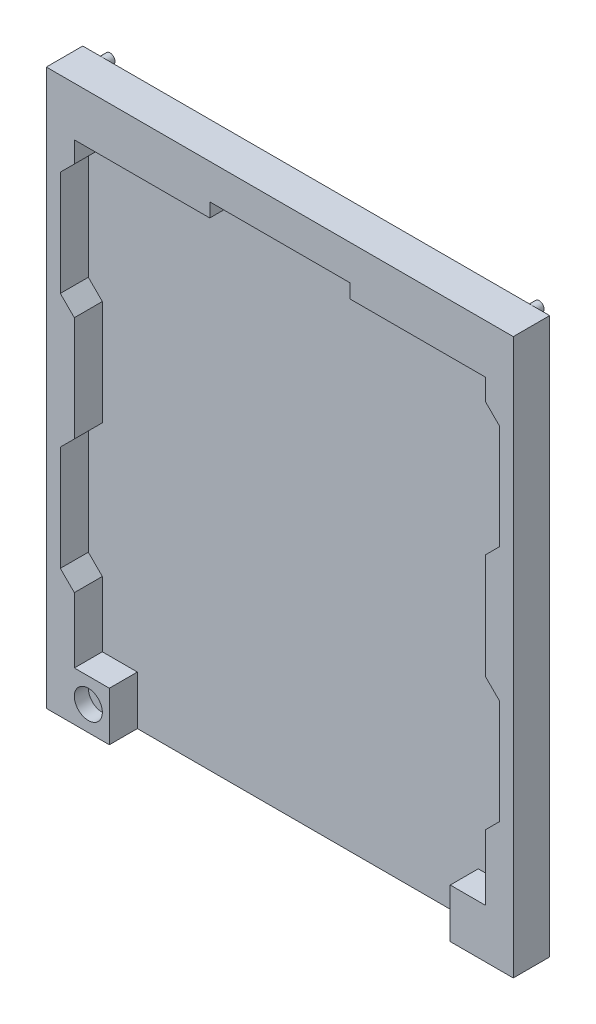
ISO-10303-21;
HEADER;
FILE_DESCRIPTION(('STEP AP214'),'2;1');
FILE_NAME('part.step','',(''),(''),'','','');
FILE_SCHEMA(('AUTOMOTIVE_DESIGN { 1 0 10303 214 1 1 1 1 }'));
ENDSEC;
DATA;
#1=APPLICATION_CONTEXT('core data for automotive mechanical design processes');
#2=APPLICATION_PROTOCOL_DEFINITION('international standard','automotive_design',2000,#1);
#3=PRODUCT_CONTEXT('',#1,'mechanical');
#4=PRODUCT('Part','Part','',(#3));
#5=PRODUCT_RELATED_PRODUCT_CATEGORY('part','',(#4));
#6=PRODUCT_DEFINITION_FORMATION('','',#4);
#7=PRODUCT_DEFINITION_CONTEXT('part definition',#1,'design');
#8=PRODUCT_DEFINITION('design','',#6,#7);
#9=PRODUCT_DEFINITION_SHAPE('','',#8);
#10=(LENGTH_UNIT() NAMED_UNIT(*) SI_UNIT(.MILLI.,.METRE.));
#11=(NAMED_UNIT(*) PLANE_ANGLE_UNIT() SI_UNIT($,.RADIAN.));
#12=(NAMED_UNIT(*) SI_UNIT($,.STERADIAN.) SOLID_ANGLE_UNIT());
#13=UNCERTAINTY_MEASURE_WITH_UNIT(LENGTH_MEASURE(1.E-05),#10,'distance_accuracy_value','');
#14=(GEOMETRIC_REPRESENTATION_CONTEXT(3) GLOBAL_UNCERTAINTY_ASSIGNED_CONTEXT((#13)) GLOBAL_UNIT_ASSIGNED_CONTEXT((#10,
#11,#12)) REPRESENTATION_CONTEXT('',''));
#15=CARTESIAN_POINT('',(0.,0.,0.));
#16=DIRECTION('',(0.,0.,1.));
#17=DIRECTION('',(1.,0.,0.));
#18=AXIS2_PLACEMENT_3D('',#15,#16,#17);
#19=CARTESIAN_POINT('',(-30.34,1.75,1.6));
#20=DIRECTION('',(0.,0.,1.));
#21=DIRECTION('',(1.,0.,0.));
#22=AXIS2_PLACEMENT_3D('',#19,#20,#21);
#23=PLANE('',#22);
#24=CARTESIAN_POINT('',(-30.34,1.75,1.6));
#25=DIRECTION('',(0.,0.,1.));
#26=DIRECTION('',(1.,0.,0.));
#27=AXIS2_PLACEMENT_3D('',#24,#25,#26);
#28=CIRCLE('',#27,1.);
#29=CARTESIAN_POINT('',(-29.34,1.75,1.6));
#30=VERTEX_POINT('',#29);
#31=EDGE_CURVE('E20',#30,#30,#28,.T.);
#32=ORIENTED_EDGE('',*,*,#31,.T.);
#33=EDGE_LOOP('',(#32));
#34=FACE_BOUND('',#33,.T.);
#35=ADVANCED_FACE('F17',(#34),#23,.T.);
#36=CARTESIAN_POINT('',(16.33,16.33,2.6));
#37=DIRECTION('',(-0.707106781186548,-0.707106781186548,0.));
#38=DIRECTION('',(0.707106781186548,-0.707106781186548,0.));
#39=AXIS2_PLACEMENT_3D('',#36,#37,#38);
#40=PLANE('',#39);
#41=DIRECTION('',(0.707106781186548,-0.707106781186548,0.));
#42=VECTOR('',#41,1.);
#43=CARTESIAN_POINT('',(16.33,16.33,2.6));
#44=LINE('',#43,#42);
#45=CARTESIAN_POINT('',(-1.,33.66,2.6));
#46=VERTEX_POINT('',#45);
#47=CARTESIAN_POINT('',(-1.99999999999999,34.66,2.6));
#48=VERTEX_POINT('',#47);
#49=EDGE_CURVE('E277',#46,#48,#44,.F.);
#50=ORIENTED_EDGE('',*,*,#49,.T.);
#51=DIRECTION('',(0.,0.,1.));
#52=VECTOR('',#51,1.);
#53=CARTESIAN_POINT('',(-1.99999999999995,34.66,2.6));
#54=LINE('',#53,#52);
#55=CARTESIAN_POINT('',(-1.99999999999999,34.66,0.599999999999999));
#56=VERTEX_POINT('',#55);
#57=EDGE_CURVE('E422',#48,#56,#54,.F.);
#58=ORIENTED_EDGE('',*,*,#57,.T.);
#59=DIRECTION('',(0.707106781186548,-0.707106781186548,0.));
#60=VECTOR('',#59,1.);
#61=CARTESIAN_POINT('',(16.33,16.33,0.599999999999999));
#62=LINE('',#61,#60);
#63=CARTESIAN_POINT('',(-1.,33.66,0.599999999999999));
#64=VERTEX_POINT('',#63);
#65=EDGE_CURVE('E279',#56,#64,#62,.T.);
#66=ORIENTED_EDGE('',*,*,#65,.T.);
#67=DIRECTION('',(0.,0.,1.));
#68=VECTOR('',#67,1.);
#69=CARTESIAN_POINT('',(-1.,33.66,2.6));
#70=LINE('',#69,#68);
#71=EDGE_CURVE('E413',#64,#46,#70,.T.);
#72=ORIENTED_EDGE('',*,*,#71,.T.);
#73=EDGE_LOOP('',(#50,#58,#66,#72));
#74=FACE_BOUND('',#73,.T.);
#75=ADVANCED_FACE('F675',(#74),#40,.T.);
#76=CARTESIAN_POINT('',(-13.58,13.58,2.6));
#77=DIRECTION('',(0.707106781186548,-0.707106781186548,0.));
#78=DIRECTION('',(0.707106781186548,0.707106781186548,0.));
#79=AXIS2_PLACEMENT_3D('',#76,#77,#78);
#80=PLANE('',#79);
#81=DIRECTION('',(0.,0.,1.));
#82=VECTOR('',#81,1.);
#83=CARTESIAN_POINT('',(-2.,25.16,2.6));
#84=LINE('',#83,#82);
#85=CARTESIAN_POINT('',(-2.,25.16,0.599999999999999));
#86=VERTEX_POINT('',#85);
#87=CARTESIAN_POINT('',(-2.,25.16,2.6));
#88=VERTEX_POINT('',#87);
#89=EDGE_CURVE('E407',#86,#88,#84,.T.);
#90=ORIENTED_EDGE('',*,*,#89,.T.);
#91=DIRECTION('',(0.707106781186548,0.707106781186548,0.));
#92=VECTOR('',#91,1.);
#93=CARTESIAN_POINT('',(-13.58,13.58,2.6));
#94=LINE('',#93,#92);
#95=CARTESIAN_POINT('',(-1.,26.16,2.6));
#96=VERTEX_POINT('',#95);
#97=EDGE_CURVE('E275',#96,#88,#94,.F.);
#98=ORIENTED_EDGE('',*,*,#97,.F.);
#99=DIRECTION('',(0.,0.,1.));
#100=VECTOR('',#99,1.);
#101=CARTESIAN_POINT('',(-1.,26.16,2.6));
#102=LINE('',#101,#100);
#103=CARTESIAN_POINT('',(-1.,26.16,0.599999999999999));
#104=VERTEX_POINT('',#103);
#105=EDGE_CURVE('E410',#96,#104,#102,.F.);
#106=ORIENTED_EDGE('',*,*,#105,.T.);
#107=DIRECTION('',(0.707106781186548,0.707106781186548,0.));
#108=VECTOR('',#107,1.);
#109=CARTESIAN_POINT('',(-13.58,13.58,0.599999999999999));
#110=LINE('',#109,#108);
#111=EDGE_CURVE('E273',#86,#104,#110,.T.);
#112=ORIENTED_EDGE('',*,*,#111,.F.);
#113=EDGE_LOOP('',(#90,#98,#106,#112));
#114=FACE_BOUND('',#113,.T.);
#115=ADVANCED_FACE('F673',(#114),#80,.F.);
#116=CARTESIAN_POINT('',(7.83,7.83,2.6));
#117=DIRECTION('',(0.707106781186548,0.707106781186548,0.));
#118=DIRECTION('',(-0.707106781186548,0.707106781186548,0.));
#119=AXIS2_PLACEMENT_3D('',#116,#117,#118);
#120=PLANE('',#119);
#121=DIRECTION('',(0.,0.,1.));
#122=VECTOR('',#121,1.);
#123=CARTESIAN_POINT('',(-1.,16.66,2.6));
#124=LINE('',#123,#122);
#125=CARTESIAN_POINT('',(-1.,16.66,0.599999999999999));
#126=VERTEX_POINT('',#125);
#127=CARTESIAN_POINT('',(-1.,16.66,2.6));
#128=VERTEX_POINT('',#127);
#129=EDGE_CURVE('E401',#126,#128,#124,.T.);
#130=ORIENTED_EDGE('',*,*,#129,.T.);
#131=DIRECTION('',(-0.707106781186548,0.707106781186548,0.));
#132=VECTOR('',#131,1.);
#133=CARTESIAN_POINT('',(7.83,7.83,2.6));
#134=LINE('',#133,#132);
#135=CARTESIAN_POINT('',(-2.,17.66,2.6));
#136=VERTEX_POINT('',#135);
#137=EDGE_CURVE('E271',#136,#128,#134,.F.);
#138=ORIENTED_EDGE('',*,*,#137,.F.);
#139=DIRECTION('',(0.,0.,1.));
#140=VECTOR('',#139,1.);
#141=CARTESIAN_POINT('',(-2.,17.66,2.6));
#142=LINE('',#141,#140);
#143=CARTESIAN_POINT('',(-2.,17.66,0.599999999999999));
#144=VERTEX_POINT('',#143);
#145=EDGE_CURVE('E404',#136,#144,#142,.F.);
#146=ORIENTED_EDGE('',*,*,#145,.T.);
#147=DIRECTION('',(-0.707106781186548,0.707106781186548,0.));
#148=VECTOR('',#147,1.);
#149=CARTESIAN_POINT('',(7.83,7.83,0.599999999999999));
#150=LINE('',#149,#148);
#151=EDGE_CURVE('E269',#126,#144,#150,.T.);
#152=ORIENTED_EDGE('',*,*,#151,.F.);
#153=EDGE_LOOP('',(#130,#138,#146,#152));
#154=FACE_BOUND('',#153,.T.);
#155=ADVANCED_FACE('F485',(#154),#120,.F.);
#156=CARTESIAN_POINT('',(-5.08,5.08,2.6));
#157=DIRECTION('',(0.707106781186548,-0.707106781186548,0.));
#158=DIRECTION('',(0.707106781186548,0.707106781186548,0.));
#159=AXIS2_PLACEMENT_3D('',#156,#157,#158);
#160=PLANE('',#159);
#161=DIRECTION('',(0.,0.,1.));
#162=VECTOR('',#161,1.);
#163=CARTESIAN_POINT('',(-2.,8.16,2.6));
#164=LINE('',#163,#162);
#165=CARTESIAN_POINT('',(-2.,8.16,0.599999999999999));
#166=VERTEX_POINT('',#165);
#167=CARTESIAN_POINT('',(-2.,8.16,2.6));
#168=VERTEX_POINT('',#167);
#169=EDGE_CURVE('E395',#166,#168,#164,.T.);
#170=ORIENTED_EDGE('',*,*,#169,.T.);
#171=DIRECTION('',(0.707106781186548,0.707106781186548,0.));
#172=VECTOR('',#171,1.);
#173=CARTESIAN_POINT('',(-5.08,5.08,2.6));
#174=LINE('',#173,#172);
#175=CARTESIAN_POINT('',(-1.,9.16,2.6));
#176=VERTEX_POINT('',#175);
#177=EDGE_CURVE('E267',#176,#168,#174,.F.);
#178=ORIENTED_EDGE('',*,*,#177,.F.);
#179=DIRECTION('',(0.,0.,1.));
#180=VECTOR('',#179,1.);
#181=CARTESIAN_POINT('',(-1.,9.16,2.6));
#182=LINE('',#181,#180);
#183=CARTESIAN_POINT('',(-1.,9.16,0.599999999999999));
#184=VERTEX_POINT('',#183);
#185=EDGE_CURVE('E398',#176,#184,#182,.F.);
#186=ORIENTED_EDGE('',*,*,#185,.T.);
#187=DIRECTION('',(0.707106781186548,0.707106781186548,0.));
#188=VECTOR('',#187,1.);
#189=CARTESIAN_POINT('',(-5.08,5.08,0.599999999999999));
#190=LINE('',#189,#188);
#191=EDGE_CURVE('E265',#166,#184,#190,.T.);
#192=ORIENTED_EDGE('',*,*,#191,.F.);
#193=EDGE_LOOP('',(#170,#178,#186,#192));
#194=FACE_BOUND('',#193,.T.);
#195=ADVANCED_FACE('F495',(#194),#160,.F.);
#196=CARTESIAN_POINT('',(-11.59,-11.59,2.6));
#197=DIRECTION('',(-0.707106781186548,-0.707106781186548,0.));
#198=DIRECTION('',(0.707106781186548,-0.707106781186548,0.));
#199=AXIS2_PLACEMENT_3D('',#196,#197,#198);
#200=PLANE('',#199);
#201=DIRECTION('',(0.,0.,1.));
#202=VECTOR('',#201,1.);
#203=CARTESIAN_POINT('',(-32.34,9.16,2.6));
#204=LINE('',#203,#202);
#205=CARTESIAN_POINT('',(-32.34,9.16000000000001,0.599999999999999));
#206=VERTEX_POINT('',#205);
#207=CARTESIAN_POINT('',(-32.34,9.16,2.6));
#208=VERTEX_POINT('',#207);
#209=EDGE_CURVE('E383',#206,#208,#204,.T.);
#210=ORIENTED_EDGE('',*,*,#209,.T.);
#211=DIRECTION('',(0.707106781186548,-0.707106781186548,0.));
#212=VECTOR('',#211,1.);
#213=CARTESIAN_POINT('',(-11.59,-11.59,2.6));
#214=LINE('',#213,#212);
#215=CARTESIAN_POINT('',(-31.34,8.16,2.6));
#216=VERTEX_POINT('',#215);
#217=EDGE_CURVE('E263',#216,#208,#214,.F.);
#218=ORIENTED_EDGE('',*,*,#217,.F.);
#219=DIRECTION('',(0.,0.,1.));
#220=VECTOR('',#219,1.);
#221=CARTESIAN_POINT('',(-31.34,8.16,2.6));
#222=LINE('',#221,#220);
#223=CARTESIAN_POINT('',(-31.34,8.16,0.599999999999999));
#224=VERTEX_POINT('',#223);
#225=EDGE_CURVE('E386',#216,#224,#222,.F.);
#226=ORIENTED_EDGE('',*,*,#225,.T.);
#227=DIRECTION('',(0.707106781186548,-0.707106781186548,0.));
#228=VECTOR('',#227,1.);
#229=CARTESIAN_POINT('',(-11.59,-11.59,0.599999999999999));
#230=LINE('',#229,#228);
#231=EDGE_CURVE('E261',#206,#224,#230,.T.);
#232=ORIENTED_EDGE('',*,*,#231,.F.);
#233=EDGE_LOOP('',(#210,#218,#226,#232));
#234=FACE_BOUND('',#233,.T.);
#235=ADVANCED_FACE('F664',(#234),#200,.F.);
#236=CARTESIAN_POINT('',(-24.5,24.5,2.6));
#237=DIRECTION('',(-0.707106781186548,0.707106781186548,0.));
#238=DIRECTION('',(-0.707106781186548,-0.707106781186548,0.));
#239=AXIS2_PLACEMENT_3D('',#236,#237,#238);
#240=PLANE('',#239);
#241=DIRECTION('',(0.,0.,1.));
#242=VECTOR('',#241,1.);
#243=CARTESIAN_POINT('',(-31.34,17.66,2.6));
#244=LINE('',#243,#242);
#245=CARTESIAN_POINT('',(-31.34,17.66,0.599999999999999));
#246=VERTEX_POINT('',#245);
#247=CARTESIAN_POINT('',(-31.34,17.66,2.6));
#248=VERTEX_POINT('',#247);
#249=EDGE_CURVE('E377',#246,#248,#244,.T.);
#250=ORIENTED_EDGE('',*,*,#249,.T.);
#251=DIRECTION('',(-0.707106781186548,-0.707106781186548,0.));
#252=VECTOR('',#251,1.);
#253=CARTESIAN_POINT('',(-24.5,24.5,2.6));
#254=LINE('',#253,#252);
#255=CARTESIAN_POINT('',(-32.34,16.66,2.6));
#256=VERTEX_POINT('',#255);
#257=EDGE_CURVE('E259',#256,#248,#254,.F.);
#258=ORIENTED_EDGE('',*,*,#257,.F.);
#259=DIRECTION('',(0.,0.,1.));
#260=VECTOR('',#259,1.);
#261=CARTESIAN_POINT('',(-32.34,16.66,2.6));
#262=LINE('',#261,#260);
#263=CARTESIAN_POINT('',(-32.34,16.66,0.599999999999999));
#264=VERTEX_POINT('',#263);
#265=EDGE_CURVE('E380',#256,#264,#262,.F.);
#266=ORIENTED_EDGE('',*,*,#265,.T.);
#267=DIRECTION('',(-0.707106781186548,-0.707106781186548,0.));
#268=VECTOR('',#267,1.);
#269=CARTESIAN_POINT('',(-24.5,24.5,0.599999999999999));
#270=LINE('',#269,#268);
#271=EDGE_CURVE('E257',#246,#264,#270,.T.);
#272=ORIENTED_EDGE('',*,*,#271,.F.);
#273=EDGE_LOOP('',(#250,#258,#266,#272));
#274=FACE_BOUND('',#273,.T.);
#275=ADVANCED_FACE('F660',(#274),#240,.F.);
#276=CARTESIAN_POINT('',(-3.09,-3.09,2.6));
#277=DIRECTION('',(-0.707106781186548,-0.707106781186548,0.));
#278=DIRECTION('',(0.707106781186548,-0.707106781186548,0.));
#279=AXIS2_PLACEMENT_3D('',#276,#277,#278);
#280=PLANE('',#279);
#281=DIRECTION('',(0.,0.,1.));
#282=VECTOR('',#281,1.);
#283=CARTESIAN_POINT('',(-32.34,26.16,2.6));
#284=LINE('',#283,#282);
#285=CARTESIAN_POINT('',(-32.34,26.16,0.599999999999999));
#286=VERTEX_POINT('',#285);
#287=CARTESIAN_POINT('',(-32.34,26.16,2.6));
#288=VERTEX_POINT('',#287);
#289=EDGE_CURVE('E371',#286,#288,#284,.T.);
#290=ORIENTED_EDGE('',*,*,#289,.T.);
#291=DIRECTION('',(0.707106781186548,-0.707106781186548,0.));
#292=VECTOR('',#291,1.);
#293=CARTESIAN_POINT('',(-3.09,-3.09,2.6));
#294=LINE('',#293,#292);
#295=CARTESIAN_POINT('',(-31.34,25.16,2.6));
#296=VERTEX_POINT('',#295);
#297=EDGE_CURVE('E255',#296,#288,#294,.F.);
#298=ORIENTED_EDGE('',*,*,#297,.F.);
#299=DIRECTION('',(0.,0.,1.));
#300=VECTOR('',#299,1.);
#301=CARTESIAN_POINT('',(-31.34,25.16,2.6));
#302=LINE('',#301,#300);
#303=CARTESIAN_POINT('',(-31.34,25.16,0.599999999999999));
#304=VERTEX_POINT('',#303);
#305=EDGE_CURVE('E374',#296,#304,#302,.F.);
#306=ORIENTED_EDGE('',*,*,#305,.T.);
#307=DIRECTION('',(0.707106781186548,-0.707106781186548,0.));
#308=VECTOR('',#307,1.);
#309=CARTESIAN_POINT('',(-3.09,-3.09,0.599999999999999));
#310=LINE('',#309,#308);
#311=EDGE_CURVE('E253',#286,#304,#310,.T.);
#312=ORIENTED_EDGE('',*,*,#311,.F.);
#313=EDGE_LOOP('',(#290,#298,#306,#312));
#314=FACE_BOUND('',#313,.T.);
#315=ADVANCED_FACE('F657',(#314),#280,.F.);
#316=CARTESIAN_POINT('',(-33.,33.,2.6));
#317=DIRECTION('',(-0.707106781186548,0.707106781186548,0.));
#318=DIRECTION('',(-0.707106781186548,-0.707106781186548,0.));
#319=AXIS2_PLACEMENT_3D('',#316,#317,#318);
#320=PLANE('',#319);
#321=DIRECTION('',(0.,0.,-1.));
#322=VECTOR('',#321,1.);
#323=CARTESIAN_POINT('',(-31.34,34.66,2.6));
#324=LINE('',#323,#322);
#325=CARTESIAN_POINT('',(-31.34,34.66,2.6));
#326=VERTEX_POINT('',#325);
#327=CARTESIAN_POINT('',(-31.34,34.66,0.6));
#328=VERTEX_POINT('',#327);
#329=EDGE_CURVE('E231',#326,#328,#324,.T.);
#330=ORIENTED_EDGE('',*,*,#329,.F.);
#331=DIRECTION('',(-0.707106781186548,-0.707106781186548,0.));
#332=VECTOR('',#331,1.);
#333=CARTESIAN_POINT('',(-33.,33.,2.6));
#334=LINE('',#333,#332);
#335=CARTESIAN_POINT('',(-32.34,33.66,2.6));
#336=VERTEX_POINT('',#335);
#337=EDGE_CURVE('E239',#336,#326,#334,.F.);
#338=ORIENTED_EDGE('',*,*,#337,.F.);
#339=DIRECTION('',(0.,0.,1.));
#340=VECTOR('',#339,1.);
#341=CARTESIAN_POINT('',(-32.34,33.66,2.6));
#342=LINE('',#341,#340);
#343=CARTESIAN_POINT('',(-32.34,33.66,0.599999999999999));
#344=VERTEX_POINT('',#343);
#345=EDGE_CURVE('E233',#336,#344,#342,.F.);
#346=ORIENTED_EDGE('',*,*,#345,.T.);
#347=DIRECTION('',(-0.707106781186548,-0.707106781186548,0.));
#348=VECTOR('',#347,1.);
#349=CARTESIAN_POINT('',(-33.,33.,0.599999999999999));
#350=LINE('',#349,#348);
#351=EDGE_CURVE('E229',#328,#344,#350,.T.);
#352=ORIENTED_EDGE('',*,*,#351,.F.);
#353=EDGE_LOOP('',(#330,#338,#346,#352));
#354=FACE_BOUND('',#353,.T.);
#355=ADVANCED_FACE('F230',(#354),#320,.F.);
#356=CARTESIAN_POINT('',(-31.34,0.,2.6));
#357=DIRECTION('',(1.,0.,0.));
#358=DIRECTION('',(0.,0.,-1.));
#359=AXIS2_PLACEMENT_3D('',#356,#357,#358);
#360=PLANE('',#359);
#361=DIRECTION('',(0.,1.,0.));
#362=VECTOR('',#361,1.);
#363=CARTESIAN_POINT('',(-31.34,0.,2.6));
#364=LINE('',#363,#362);
#365=CARTESIAN_POINT('',(-31.34,36.16,2.6));
#366=VERTEX_POINT('',#365);
#367=EDGE_CURVE('E223',#366,#326,#364,.F.);
#368=ORIENTED_EDGE('',*,*,#367,.T.);
#369=ORIENTED_EDGE('',*,*,#329,.T.);
#370=DIRECTION('',(0.,1.,0.));
#371=VECTOR('',#370,1.);
#372=CARTESIAN_POINT('',(-31.34,0.,0.6));
#373=LINE('',#372,#371);
#374=CARTESIAN_POINT('',(-31.34,36.16,0.6));
#375=VERTEX_POINT('',#374);
#376=EDGE_CURVE('E238',#328,#375,#373,.T.);
#377=ORIENTED_EDGE('',*,*,#376,.T.);
#378=DIRECTION('',(0.,0.,1.));
#379=VECTOR('',#378,1.);
#380=CARTESIAN_POINT('',(-31.34,36.16,2.6));
#381=LINE('',#380,#379);
#382=EDGE_CURVE('E368',#375,#366,#381,.T.);
#383=ORIENTED_EDGE('',*,*,#382,.T.);
#384=EDGE_LOOP('',(#368,#369,#377,#383));
#385=FACE_BOUND('',#384,.T.);
#386=ADVANCED_FACE('F241',(#385),#360,.T.);
#387=CARTESIAN_POINT('',(-21.67,0.,2.6));
#388=DIRECTION('',(-1.,0.,0.));
#389=DIRECTION('',(0.,0.,1.));
#390=AXIS2_PLACEMENT_3D('',#387,#388,#389);
#391=PLANE('',#390);
#392=DIRECTION('',(0.,0.,-1.));
#393=VECTOR('',#392,1.);
#394=CARTESIAN_POINT('',(-21.67,37.16,2.6));
#395=LINE('',#394,#393);
#396=CARTESIAN_POINT('',(-21.67,37.16,2.6));
#397=VERTEX_POINT('',#396);
#398=CARTESIAN_POINT('',(-21.67,37.16,0.6));
#399=VERTEX_POINT('',#398);
#400=EDGE_CURVE('E359',#397,#399,#395,.T.);
#401=ORIENTED_EDGE('',*,*,#400,.F.);
#402=DIRECTION('',(0.,1.,0.));
#403=VECTOR('',#402,1.);
#404=CARTESIAN_POINT('',(-21.67,0.,2.6));
#405=LINE('',#404,#403);
#406=CARTESIAN_POINT('',(-21.67,36.16,2.6));
#407=VERTEX_POINT('',#406);
#408=EDGE_CURVE('E243',#407,#397,#405,.T.);
#409=ORIENTED_EDGE('',*,*,#408,.F.);
#410=DIRECTION('',(0.,0.,1.));
#411=VECTOR('',#410,1.);
#412=CARTESIAN_POINT('',(-21.67,36.16,2.6));
#413=LINE('',#412,#411);
#414=CARTESIAN_POINT('',(-21.67,36.16,0.6));
#415=VERTEX_POINT('',#414);
#416=EDGE_CURVE('E365',#407,#415,#413,.F.);
#417=ORIENTED_EDGE('',*,*,#416,.T.);
#418=DIRECTION('',(0.,1.,0.));
#419=VECTOR('',#418,1.);
#420=CARTESIAN_POINT('',(-21.67,0.,0.6));
#421=LINE('',#420,#419);
#422=EDGE_CURVE('E428',#399,#415,#421,.F.);
#423=ORIENTED_EDGE('',*,*,#422,.F.);
#424=EDGE_LOOP('',(#401,#409,#417,#423));
#425=FACE_BOUND('',#424,.T.);
#426=ADVANCED_FACE('F442',(#425),#391,.F.);
#427=CARTESIAN_POINT('',(-2.,0.,2.6));
#428=DIRECTION('',(1.,0.,0.));
#429=DIRECTION('',(0.,1.,0.));
#430=AXIS2_PLACEMENT_3D('',#427,#428,#429);
#431=PLANE('',#430);
#432=ORIENTED_EDGE('',*,*,#57,.F.);
#433=DIRECTION('',(0.,1.,0.));
#434=VECTOR('',#433,1.);
#435=CARTESIAN_POINT('',(-2.,0.,2.6));
#436=LINE('',#435,#434);
#437=CARTESIAN_POINT('',(-1.99999999999997,36.16,2.6));
#438=VERTEX_POINT('',#437);
#439=EDGE_CURVE('E425',#438,#48,#436,.F.);
#440=ORIENTED_EDGE('',*,*,#439,.F.);
#441=DIRECTION('',(0.,0.,-1.));
#442=VECTOR('',#441,1.);
#443=CARTESIAN_POINT('',(-2.,36.16,2.6));
#444=LINE('',#443,#442);
#445=CARTESIAN_POINT('',(-1.99999999999997,36.16,0.6));
#446=VERTEX_POINT('',#445);
#447=EDGE_CURVE('E356',#446,#438,#444,.F.);
#448=ORIENTED_EDGE('',*,*,#447,.F.);
#449=DIRECTION('',(0.,1.,0.));
#450=VECTOR('',#449,1.);
#451=CARTESIAN_POINT('',(-2.,0.,0.6));
#452=LINE('',#451,#450);
#453=EDGE_CURVE('E420',#56,#446,#452,.T.);
#454=ORIENTED_EDGE('',*,*,#453,.F.);
#455=EDGE_LOOP('',(#432,#440,#448,#454));
#456=FACE_BOUND('',#455,.T.);
#457=ADVANCED_FACE('F646',(#456),#431,.F.);
#458=CARTESIAN_POINT('',(-11.67,0.,2.6));
#459=DIRECTION('',(-1.,0.,0.));
#460=DIRECTION('',(0.,0.,1.));
#461=AXIS2_PLACEMENT_3D('',#458,#459,#460);
#462=PLANE('',#461);
#463=DIRECTION('',(0.,1.,0.));
#464=VECTOR('',#463,1.);
#465=CARTESIAN_POINT('',(-11.67,0.,2.6));
#466=LINE('',#465,#464);
#467=CARTESIAN_POINT('',(-11.67,36.16,2.6));
#468=VERTEX_POINT('',#467);
#469=CARTESIAN_POINT('',(-11.67,37.16,2.6));
#470=VERTEX_POINT('',#469);
#471=EDGE_CURVE('E416',#468,#470,#466,.T.);
#472=ORIENTED_EDGE('',*,*,#471,.T.);
#473=DIRECTION('',(0.,0.,-1.));
#474=VECTOR('',#473,1.);
#475=CARTESIAN_POINT('',(-11.67,37.16,2.6));
#476=LINE('',#475,#474);
#477=CARTESIAN_POINT('',(-11.67,37.16,0.6));
#478=VERTEX_POINT('',#477);
#479=EDGE_CURVE('E362',#478,#470,#476,.F.);
#480=ORIENTED_EDGE('',*,*,#479,.F.);
#481=DIRECTION('',(0.,1.,0.));
#482=VECTOR('',#481,1.);
#483=CARTESIAN_POINT('',(-11.67,0.,0.6));
#484=LINE('',#483,#482);
#485=CARTESIAN_POINT('',(-11.67,36.16,0.6));
#486=VERTEX_POINT('',#485);
#487=EDGE_CURVE('E418',#478,#486,#484,.F.);
#488=ORIENTED_EDGE('',*,*,#487,.T.);
#489=DIRECTION('',(0.,0.,-1.));
#490=VECTOR('',#489,1.);
#491=CARTESIAN_POINT('',(-11.67,36.16,2.6));
#492=LINE('',#491,#490);
#493=EDGE_CURVE('E353',#468,#486,#492,.T.);
#494=ORIENTED_EDGE('',*,*,#493,.F.);
#495=EDGE_LOOP('',(#472,#480,#488,#494));
#496=FACE_BOUND('',#495,.T.);
#497=ADVANCED_FACE('F642',(#496),#462,.T.);
#498=CARTESIAN_POINT('',(-30.34,1.75,1.6));
#499=DIRECTION('',(0.,0.,1.));
#500=DIRECTION('',(1.,0.,0.));
#501=AXIS2_PLACEMENT_3D('',#498,#499,#500);
#502=CYLINDRICAL_SURFACE('',#501,1.);
#503=CARTESIAN_POINT('',(-30.34,1.75,2.6));
#504=DIRECTION('',(0.,0.,1.));
#505=DIRECTION('',(1.,0.,0.));
#506=AXIS2_PLACEMENT_3D('',#503,#504,#505);
#507=CIRCLE('',#506,1.);
#508=CARTESIAN_POINT('',(-29.34,1.75,2.6));
#509=VERTEX_POINT('',#508);
#510=EDGE_CURVE('E296',#509,#509,#507,.F.);
#511=ORIENTED_EDGE('',*,*,#510,.F.);
#512=EDGE_LOOP('',(#511));
#513=FACE_BOUND('',#512,.T.);
#514=ORIENTED_EDGE('',*,*,#31,.F.);
#515=EDGE_LOOP('',(#514));
#516=FACE_BOUND('',#515,.T.);
#517=ADVANCED_FACE('F638',(#513,#516),#502,.F.);
#518=CARTESIAN_POINT('',(-1.,0.,2.6));
#519=DIRECTION('',(1.,0.,0.));
#520=DIRECTION('',(0.,1.,0.));
#521=AXIS2_PLACEMENT_3D('',#518,#519,#520);
#522=PLANE('',#521);
#523=ORIENTED_EDGE('',*,*,#105,.F.);
#524=DIRECTION('',(0.,1.,0.));
#525=VECTOR('',#524,1.);
#526=CARTESIAN_POINT('',(-1.,0.,2.6));
#527=LINE('',#526,#525);
#528=EDGE_CURVE('E298',#46,#96,#527,.F.);
#529=ORIENTED_EDGE('',*,*,#528,.F.);
#530=ORIENTED_EDGE('',*,*,#71,.F.);
#531=DIRECTION('',(0.,1.,0.));
#532=VECTOR('',#531,1.);
#533=CARTESIAN_POINT('',(-1.,0.,0.6));
#534=LINE('',#533,#532);
#535=EDGE_CURVE('E336',#104,#64,#534,.T.);
#536=ORIENTED_EDGE('',*,*,#535,.F.);
#537=EDGE_LOOP('',(#523,#529,#530,#536));
#538=FACE_BOUND('',#537,.T.);
#539=ADVANCED_FACE('F635',(#538),#522,.F.);
#540=CARTESIAN_POINT('',(-2.,0.,2.6));
#541=DIRECTION('',(1.,0.,0.));
#542=DIRECTION('',(0.,1.,0.));
#543=AXIS2_PLACEMENT_3D('',#540,#541,#542);
#544=PLANE('',#543);
#545=ORIENTED_EDGE('',*,*,#145,.F.);
#546=DIRECTION('',(0.,1.,0.));
#547=VECTOR('',#546,1.);
#548=CARTESIAN_POINT('',(-2.,0.,2.6));
#549=LINE('',#548,#547);
#550=EDGE_CURVE('E303',#88,#136,#549,.F.);
#551=ORIENTED_EDGE('',*,*,#550,.F.);
#552=ORIENTED_EDGE('',*,*,#89,.F.);
#553=DIRECTION('',(0.,1.,0.));
#554=VECTOR('',#553,1.);
#555=CARTESIAN_POINT('',(-2.,0.,0.6));
#556=LINE('',#555,#554);
#557=EDGE_CURVE('E339',#144,#86,#556,.T.);
#558=ORIENTED_EDGE('',*,*,#557,.F.);
#559=EDGE_LOOP('',(#545,#551,#552,#558));
#560=FACE_BOUND('',#559,.T.);
#561=ADVANCED_FACE('F482',(#560),#544,.F.);
#562=CARTESIAN_POINT('',(-1.,0.,2.6));
#563=DIRECTION('',(1.,0.,0.));
#564=DIRECTION('',(0.,1.,0.));
#565=AXIS2_PLACEMENT_3D('',#562,#563,#564);
#566=PLANE('',#565);
#567=ORIENTED_EDGE('',*,*,#185,.F.);
#568=DIRECTION('',(0.,1.,0.));
#569=VECTOR('',#568,1.);
#570=CARTESIAN_POINT('',(-1.,0.,2.6));
#571=LINE('',#570,#569);
#572=EDGE_CURVE('E475',#128,#176,#571,.F.);
#573=ORIENTED_EDGE('',*,*,#572,.F.);
#574=ORIENTED_EDGE('',*,*,#129,.F.);
#575=DIRECTION('',(0.,1.,0.));
#576=VECTOR('',#575,1.);
#577=CARTESIAN_POINT('',(-1.,0.,0.6));
#578=LINE('',#577,#576);
#579=EDGE_CURVE('E342',#184,#126,#578,.T.);
#580=ORIENTED_EDGE('',*,*,#579,.F.);
#581=EDGE_LOOP('',(#567,#573,#574,#580));
#582=FACE_BOUND('',#581,.T.);
#583=ADVANCED_FACE('F491',(#582),#566,.F.);
#584=CARTESIAN_POINT('',(-2.,0.,2.6));
#585=DIRECTION('',(1.,0.,0.));
#586=DIRECTION('',(0.,1.,0.));
#587=AXIS2_PLACEMENT_3D('',#584,#585,#586);
#588=PLANE('',#587);
#589=DIRECTION('',(0.,0.,1.));
#590=VECTOR('',#589,1.);
#591=CARTESIAN_POINT('',(-2.,3.5,2.6));
#592=LINE('',#591,#590);
#593=CARTESIAN_POINT('',(-2.,3.5,0.6));
#594=VERTEX_POINT('',#593);
#595=CARTESIAN_POINT('',(-2.,3.5,2.6));
#596=VERTEX_POINT('',#595);
#597=EDGE_CURVE('E392',#594,#596,#592,.T.);
#598=ORIENTED_EDGE('',*,*,#597,.T.);
#599=DIRECTION('',(0.,1.,0.));
#600=VECTOR('',#599,1.);
#601=CARTESIAN_POINT('',(-2.,0.,2.6));
#602=LINE('',#601,#600);
#603=EDGE_CURVE('E473',#168,#596,#602,.F.);
#604=ORIENTED_EDGE('',*,*,#603,.F.);
#605=ORIENTED_EDGE('',*,*,#169,.F.);
#606=DIRECTION('',(0.,1.,0.));
#607=VECTOR('',#606,1.);
#608=CARTESIAN_POINT('',(-2.,0.,0.6));
#609=LINE('',#608,#607);
#610=EDGE_CURVE('E345',#594,#166,#609,.T.);
#611=ORIENTED_EDGE('',*,*,#610,.F.);
#612=EDGE_LOOP('',(#598,#604,#605,#611));
#613=FACE_BOUND('',#612,.T.);
#614=ADVANCED_FACE('F498',(#613),#588,.F.);
#615=CARTESIAN_POINT('',(0.,3.5,2.6));
#616=DIRECTION('',(0.,-1.,0.));
#617=DIRECTION('',(1.,0.,0.));
#618=AXIS2_PLACEMENT_3D('',#615,#616,#617);
#619=PLANE('',#618);
#620=DIRECTION('',(0.,0.,-1.));
#621=VECTOR('',#620,1.);
#622=CARTESIAN_POINT('',(-4.5,3.5,2.6));
#623=LINE('',#622,#621);
#624=CARTESIAN_POINT('',(-4.5,3.5,0.6));
#625=VERTEX_POINT('',#624);
#626=CARTESIAN_POINT('',(-4.5,3.5,2.6));
#627=VERTEX_POINT('',#626);
#628=EDGE_CURVE('E306',#625,#627,#623,.F.);
#629=ORIENTED_EDGE('',*,*,#628,.T.);
#630=DIRECTION('',(1.,0.,0.));
#631=VECTOR('',#630,1.);
#632=CARTESIAN_POINT('',(0.,3.5,2.6));
#633=LINE('',#632,#631);
#634=EDGE_CURVE('E471',#596,#627,#633,.F.);
#635=ORIENTED_EDGE('',*,*,#634,.F.);
#636=ORIENTED_EDGE('',*,*,#597,.F.);
#637=DIRECTION('',(1.,0.,0.));
#638=VECTOR('',#637,1.);
#639=CARTESIAN_POINT('',(0.,3.5,0.6));
#640=LINE('',#639,#638);
#641=EDGE_CURVE('E348',#625,#594,#640,.T.);
#642=ORIENTED_EDGE('',*,*,#641,.F.);
#643=EDGE_LOOP('',(#629,#635,#636,#642));
#644=FACE_BOUND('',#643,.T.);
#645=ADVANCED_FACE('F502',(#644),#619,.F.);
#646=CARTESIAN_POINT('',(0.,3.5,2.6));
#647=DIRECTION('',(0.,-1.,0.));
#648=DIRECTION('',(1.,0.,0.));
#649=AXIS2_PLACEMENT_3D('',#646,#647,#648);
#650=PLANE('',#649);
#651=DIRECTION('',(0.,0.,1.));
#652=VECTOR('',#651,1.);
#653=CARTESIAN_POINT('',(-31.34,3.5,2.6));
#654=LINE('',#653,#652);
#655=CARTESIAN_POINT('',(-31.34,3.5,0.6));
#656=VERTEX_POINT('',#655);
#657=CARTESIAN_POINT('',(-31.34,3.5,2.6));
#658=VERTEX_POINT('',#657);
#659=EDGE_CURVE('E389',#656,#658,#654,.T.);
#660=ORIENTED_EDGE('',*,*,#659,.T.);
#661=DIRECTION('',(1.,0.,0.));
#662=VECTOR('',#661,1.);
#663=CARTESIAN_POINT('',(0.,3.5,2.6));
#664=LINE('',#663,#662);
#665=CARTESIAN_POINT('',(-28.84,3.5,2.6));
#666=VERTEX_POINT('',#665);
#667=EDGE_CURVE('E464',#666,#658,#664,.F.);
#668=ORIENTED_EDGE('',*,*,#667,.F.);
#669=DIRECTION('',(0.,0.,1.));
#670=VECTOR('',#669,1.);
#671=CARTESIAN_POINT('',(-28.84,3.5,2.6));
#672=LINE('',#671,#670);
#673=CARTESIAN_POINT('',(-28.84,3.5,0.6));
#674=VERTEX_POINT('',#673);
#675=EDGE_CURVE('E350',#666,#674,#672,.F.);
#676=ORIENTED_EDGE('',*,*,#675,.T.);
#677=DIRECTION('',(1.,0.,0.));
#678=VECTOR('',#677,1.);
#679=CARTESIAN_POINT('',(0.,3.5,0.6));
#680=LINE('',#679,#678);
#681=EDGE_CURVE('E316',#656,#674,#680,.T.);
#682=ORIENTED_EDGE('',*,*,#681,.F.);
#683=EDGE_LOOP('',(#660,#668,#676,#682));
#684=FACE_BOUND('',#683,.T.);
#685=ADVANCED_FACE('F622',(#684),#650,.F.);
#686=CARTESIAN_POINT('',(-31.34,0.,2.6));
#687=DIRECTION('',(-1.,0.,0.));
#688=DIRECTION('',(0.,0.,1.));
#689=AXIS2_PLACEMENT_3D('',#686,#687,#688);
#690=PLANE('',#689);
#691=ORIENTED_EDGE('',*,*,#225,.F.);
#692=DIRECTION('',(0.,1.,0.));
#693=VECTOR('',#692,1.);
#694=CARTESIAN_POINT('',(-31.34,0.,2.6));
#695=LINE('',#694,#693);
#696=EDGE_CURVE('E461',#658,#216,#695,.T.);
#697=ORIENTED_EDGE('',*,*,#696,.F.);
#698=ORIENTED_EDGE('',*,*,#659,.F.);
#699=DIRECTION('',(0.,1.,0.));
#700=VECTOR('',#699,1.);
#701=CARTESIAN_POINT('',(-31.34,0.,0.6));
#702=LINE('',#701,#700);
#703=EDGE_CURVE('E318',#224,#656,#702,.F.);
#704=ORIENTED_EDGE('',*,*,#703,.F.);
#705=EDGE_LOOP('',(#691,#697,#698,#704));
#706=FACE_BOUND('',#705,.T.);
#707=ADVANCED_FACE('F618',(#706),#690,.F.);
#708=CARTESIAN_POINT('',(-32.34,0.,2.6));
#709=DIRECTION('',(-1.,0.,0.));
#710=DIRECTION('',(0.,0.,1.));
#711=AXIS2_PLACEMENT_3D('',#708,#709,#710);
#712=PLANE('',#711);
#713=ORIENTED_EDGE('',*,*,#265,.F.);
#714=DIRECTION('',(0.,1.,0.));
#715=VECTOR('',#714,1.);
#716=CARTESIAN_POINT('',(-32.34,0.,2.6));
#717=LINE('',#716,#715);
#718=EDGE_CURVE('E458',#208,#256,#717,.T.);
#719=ORIENTED_EDGE('',*,*,#718,.F.);
#720=ORIENTED_EDGE('',*,*,#209,.F.);
#721=DIRECTION('',(0.,1.,0.));
#722=VECTOR('',#721,1.);
#723=CARTESIAN_POINT('',(-32.34,0.,0.6));
#724=LINE('',#723,#722);
#725=EDGE_CURVE('E321',#264,#206,#724,.F.);
#726=ORIENTED_EDGE('',*,*,#725,.F.);
#727=EDGE_LOOP('',(#713,#719,#720,#726));
#728=FACE_BOUND('',#727,.T.);
#729=ADVANCED_FACE('F614',(#728),#712,.F.);
#730=CARTESIAN_POINT('',(-31.34,0.,2.6));
#731=DIRECTION('',(-1.,0.,0.));
#732=DIRECTION('',(0.,-1.,0.));
#733=AXIS2_PLACEMENT_3D('',#730,#731,#732);
#734=PLANE('',#733);
#735=ORIENTED_EDGE('',*,*,#305,.F.);
#736=DIRECTION('',(0.,1.,0.));
#737=VECTOR('',#736,1.);
#738=CARTESIAN_POINT('',(-31.34,0.,2.6));
#739=LINE('',#738,#737);
#740=EDGE_CURVE('E455',#248,#296,#739,.T.);
#741=ORIENTED_EDGE('',*,*,#740,.F.);
#742=ORIENTED_EDGE('',*,*,#249,.F.);
#743=DIRECTION('',(0.,1.,0.));
#744=VECTOR('',#743,1.);
#745=CARTESIAN_POINT('',(-31.34,0.,0.6));
#746=LINE('',#745,#744);
#747=EDGE_CURVE('E324',#304,#246,#746,.F.);
#748=ORIENTED_EDGE('',*,*,#747,.F.);
#749=EDGE_LOOP('',(#735,#741,#742,#748));
#750=FACE_BOUND('',#749,.T.);
#751=ADVANCED_FACE('F610',(#750),#734,.F.);
#752=CARTESIAN_POINT('',(-32.34,0.,2.6));
#753=DIRECTION('',(-1.,0.,0.));
#754=DIRECTION('',(0.,0.,1.));
#755=AXIS2_PLACEMENT_3D('',#752,#753,#754);
#756=PLANE('',#755);
#757=ORIENTED_EDGE('',*,*,#345,.F.);
#758=DIRECTION('',(0.,1.,0.));
#759=VECTOR('',#758,1.);
#760=CARTESIAN_POINT('',(-32.34,0.,2.6));
#761=LINE('',#760,#759);
#762=EDGE_CURVE('E449',#288,#336,#761,.T.);
#763=ORIENTED_EDGE('',*,*,#762,.F.);
#764=ORIENTED_EDGE('',*,*,#289,.F.);
#765=DIRECTION('',(0.,1.,0.));
#766=VECTOR('',#765,1.);
#767=CARTESIAN_POINT('',(-32.34,0.,0.6));
#768=LINE('',#767,#766);
#769=EDGE_CURVE('E327',#344,#286,#768,.F.);
#770=ORIENTED_EDGE('',*,*,#769,.F.);
#771=EDGE_LOOP('',(#757,#763,#764,#770));
#772=FACE_BOUND('',#771,.T.);
#773=ADVANCED_FACE('F606',(#772),#756,.F.);
#774=CARTESIAN_POINT('',(0.,36.16,2.6));
#775=DIRECTION('',(0.,1.,0.));
#776=DIRECTION('',(0.,0.,1.));
#777=AXIS2_PLACEMENT_3D('',#774,#775,#776);
#778=PLANE('',#777);
#779=ORIENTED_EDGE('',*,*,#416,.F.);
#780=DIRECTION('',(1.,0.,0.));
#781=VECTOR('',#780,1.);
#782=CARTESIAN_POINT('',(0.,36.16,2.6));
#783=LINE('',#782,#781);
#784=EDGE_CURVE('E439',#366,#407,#783,.T.);
#785=ORIENTED_EDGE('',*,*,#784,.F.);
#786=ORIENTED_EDGE('',*,*,#382,.F.);
#787=DIRECTION('',(1.,0.,0.));
#788=VECTOR('',#787,1.);
#789=CARTESIAN_POINT('',(0.,36.16,0.6));
#790=LINE('',#789,#788);
#791=EDGE_CURVE('E248',#415,#375,#790,.F.);
#792=ORIENTED_EDGE('',*,*,#791,.F.);
#793=EDGE_LOOP('',(#779,#785,#786,#792));
#794=FACE_BOUND('',#793,.T.);
#795=ADVANCED_FACE('F603',(#794),#778,.F.);
#796=CARTESIAN_POINT('',(0.,37.16,2.6));
#797=DIRECTION('',(0.,-1.,0.));
#798=DIRECTION('',(0.,0.,-1.));
#799=AXIS2_PLACEMENT_3D('',#796,#797,#798);
#800=PLANE('',#799);
#801=DIRECTION('',(1.,0.,0.));
#802=VECTOR('',#801,1.);
#803=CARTESIAN_POINT('',(0.,37.16,2.6));
#804=LINE('',#803,#802);
#805=EDGE_CURVE('E437',#397,#470,#804,.T.);
#806=ORIENTED_EDGE('',*,*,#805,.F.);
#807=ORIENTED_EDGE('',*,*,#400,.T.);
#808=DIRECTION('',(1.,0.,0.));
#809=VECTOR('',#808,1.);
#810=CARTESIAN_POINT('',(0.,37.16,0.6));
#811=LINE('',#810,#809);
#812=EDGE_CURVE('E330',#478,#399,#811,.F.);
#813=ORIENTED_EDGE('',*,*,#812,.F.);
#814=ORIENTED_EDGE('',*,*,#479,.T.);
#815=EDGE_LOOP('',(#806,#807,#813,#814));
#816=FACE_BOUND('',#815,.T.);
#817=ADVANCED_FACE('F445',(#816),#800,.T.);
#818=CARTESIAN_POINT('',(0.,36.16,2.6));
#819=DIRECTION('',(0.,-1.,0.));
#820=DIRECTION('',(0.,0.,-1.));
#821=AXIS2_PLACEMENT_3D('',#818,#819,#820);
#822=PLANE('',#821);
#823=DIRECTION('',(1.,0.,0.));
#824=VECTOR('',#823,1.);
#825=CARTESIAN_POINT('',(0.,36.16,2.6));
#826=LINE('',#825,#824);
#827=EDGE_CURVE('E295',#468,#438,#826,.T.);
#828=ORIENTED_EDGE('',*,*,#827,.F.);
#829=ORIENTED_EDGE('',*,*,#493,.T.);
#830=DIRECTION('',(1.,0.,0.));
#831=VECTOR('',#830,1.);
#832=CARTESIAN_POINT('',(0.,36.16,0.6));
#833=LINE('',#832,#831);
#834=EDGE_CURVE('E333',#446,#486,#833,.F.);
#835=ORIENTED_EDGE('',*,*,#834,.F.);
#836=ORIENTED_EDGE('',*,*,#447,.T.);
#837=EDGE_LOOP('',(#828,#829,#835,#836));
#838=FACE_BOUND('',#837,.T.);
#839=ADVANCED_FACE('F596',(#838),#822,.T.);
#840=CARTESIAN_POINT('',(-31.99,39.26,-0.6));
#841=DIRECTION('',(0.,0.,-1.));
#842=DIRECTION('',(-1.,0.,0.));
#843=AXIS2_PLACEMENT_3D('',#840,#841,#842);
#844=PLANE('',#843);
#845=CARTESIAN_POINT('',(-31.99,39.26,-0.6));
#846=DIRECTION('',(0.,0.,1.));
#847=DIRECTION('',(1.,0.,0.));
#848=AXIS2_PLACEMENT_3D('',#845,#846,#847);
#849=CIRCLE('',#848,0.35);
#850=CARTESIAN_POINT('',(-31.64,39.26,-0.6));
#851=VERTEX_POINT('',#850);
#852=EDGE_CURVE('E293',#851,#851,#849,.T.);
#853=ORIENTED_EDGE('',*,*,#852,.F.);
#854=EDGE_LOOP('',(#853));
#855=FACE_BOUND('',#854,.T.);
#856=ADVANCED_FACE('F592',(#855),#844,.T.);
#857=CARTESIAN_POINT('',(-1.35,39.26,-0.6));
#858=DIRECTION('',(0.,0.,-1.));
#859=DIRECTION('',(-1.,0.,0.));
#860=AXIS2_PLACEMENT_3D('',#857,#858,#859);
#861=PLANE('',#860);
#862=CARTESIAN_POINT('',(-1.35,39.26,-0.6));
#863=DIRECTION('',(0.,0.,1.));
#864=DIRECTION('',(1.,0.,0.));
#865=AXIS2_PLACEMENT_3D('',#862,#863,#864);
#866=CIRCLE('',#865,0.35);
#867=CARTESIAN_POINT('',(-1.,39.26,-0.6));
#868=VERTEX_POINT('',#867);
#869=EDGE_CURVE('E289',#868,#868,#866,.T.);
#870=ORIENTED_EDGE('',*,*,#869,.F.);
#871=EDGE_LOOP('',(#870));
#872=FACE_BOUND('',#871,.T.);
#873=ADVANCED_FACE('F588',(#872),#861,.T.);
#874=CARTESIAN_POINT('',(-28.84,0.,2.6));
#875=DIRECTION('',(-1.,0.,0.));
#876=DIRECTION('',(0.,0.,1.));
#877=AXIS2_PLACEMENT_3D('',#874,#875,#876);
#878=PLANE('',#877);
#879=ORIENTED_EDGE('',*,*,#675,.F.);
#880=DIRECTION('',(0.,1.,0.));
#881=VECTOR('',#880,1.);
#882=CARTESIAN_POINT('',(-28.84,0.,2.6));
#883=LINE('',#882,#881);
#884=CARTESIAN_POINT('',(-28.84,0.,2.6));
#885=VERTEX_POINT('',#884);
#886=EDGE_CURVE('E466',#885,#666,#883,.T.);
#887=ORIENTED_EDGE('',*,*,#886,.F.);
#888=DIRECTION('',(0.,0.,1.));
#889=VECTOR('',#888,1.);
#890=CARTESIAN_POINT('',(-28.84,0.,0.6));
#891=LINE('',#890,#889);
#892=CARTESIAN_POINT('',(-28.84,0.,0.6));
#893=VERTEX_POINT('',#892);
#894=EDGE_CURVE('E521',#885,#893,#891,.F.);
#895=ORIENTED_EDGE('',*,*,#894,.T.);
#896=DIRECTION('',(0.,1.,0.));
#897=VECTOR('',#896,1.);
#898=CARTESIAN_POINT('',(-28.84,0.,0.6));
#899=LINE('',#898,#897);
#900=EDGE_CURVE('E311',#674,#893,#899,.F.);
#901=ORIENTED_EDGE('',*,*,#900,.F.);
#902=EDGE_LOOP('',(#879,#887,#895,#901));
#903=FACE_BOUND('',#902,.T.);
#904=ADVANCED_FACE('F585',(#903),#878,.F.);
#905=CARTESIAN_POINT('',(0.,0.,0.6));
#906=DIRECTION('',(0.,0.,1.));
#907=DIRECTION('',(1.,0.,0.));
#908=AXIS2_PLACEMENT_3D('',#905,#906,#907);
#909=PLANE('',#908);
#910=ORIENTED_EDGE('',*,*,#681,.T.);
#911=ORIENTED_EDGE('',*,*,#900,.T.);
#912=DIRECTION('',(1.,0.,0.));
#913=VECTOR('',#912,1.);
#914=CARTESIAN_POINT('',(-33.34,0.,0.6));
#915=LINE('',#914,#913);
#916=CARTESIAN_POINT('',(-4.5,0.,0.6));
#917=VERTEX_POINT('',#916);
#918=EDGE_CURVE('E519',#893,#917,#915,.T.);
#919=ORIENTED_EDGE('',*,*,#918,.T.);
#920=DIRECTION('',(0.,1.,0.));
#921=VECTOR('',#920,1.);
#922=CARTESIAN_POINT('',(-4.5,0.,0.6));
#923=LINE('',#922,#921);
#924=EDGE_CURVE('E299',#917,#625,#923,.T.);
#925=ORIENTED_EDGE('',*,*,#924,.T.);
#926=ORIENTED_EDGE('',*,*,#641,.T.);
#927=ORIENTED_EDGE('',*,*,#610,.T.);
#928=ORIENTED_EDGE('',*,*,#191,.T.);
#929=ORIENTED_EDGE('',*,*,#579,.T.);
#930=ORIENTED_EDGE('',*,*,#151,.T.);
#931=ORIENTED_EDGE('',*,*,#557,.T.);
#932=ORIENTED_EDGE('',*,*,#111,.T.);
#933=ORIENTED_EDGE('',*,*,#535,.T.);
#934=ORIENTED_EDGE('',*,*,#65,.F.);
#935=ORIENTED_EDGE('',*,*,#453,.T.);
#936=ORIENTED_EDGE('',*,*,#834,.T.);
#937=ORIENTED_EDGE('',*,*,#487,.F.);
#938=ORIENTED_EDGE('',*,*,#812,.T.);
#939=ORIENTED_EDGE('',*,*,#422,.T.);
#940=ORIENTED_EDGE('',*,*,#791,.T.);
#941=ORIENTED_EDGE('',*,*,#376,.F.);
#942=ORIENTED_EDGE('',*,*,#351,.T.);
#943=ORIENTED_EDGE('',*,*,#769,.T.);
#944=ORIENTED_EDGE('',*,*,#311,.T.);
#945=ORIENTED_EDGE('',*,*,#747,.T.);
#946=ORIENTED_EDGE('',*,*,#271,.T.);
#947=ORIENTED_EDGE('',*,*,#725,.T.);
#948=ORIENTED_EDGE('',*,*,#231,.T.);
#949=ORIENTED_EDGE('',*,*,#703,.T.);
#950=EDGE_LOOP('',(#910,#911,#919,#925,#926,#927,#928,#929,#930,#931,#932,#933,#934,#935,#936,
#937,#938,#939,#940,#941,#942,#943,#944,#945,#946,#947,#948,#949));
#951=FACE_BOUND('',#950,.T.);
#952=ADVANCED_FACE('F246',(#951),#909,.T.);
#953=CARTESIAN_POINT('',(-4.5,0.,2.6));
#954=DIRECTION('',(1.,0.,0.));
#955=DIRECTION('',(0.,0.,-1.));
#956=AXIS2_PLACEMENT_3D('',#953,#954,#955);
#957=PLANE('',#956);
#958=DIRECTION('',(0.,0.,1.));
#959=VECTOR('',#958,1.);
#960=CARTESIAN_POINT('',(-4.5,0.,0.6));
#961=LINE('',#960,#959);
#962=CARTESIAN_POINT('',(-4.5,0.,2.6));
#963=VERTEX_POINT('',#962);
#964=EDGE_CURVE('E514',#917,#963,#961,.T.);
#965=ORIENTED_EDGE('',*,*,#964,.T.);
#966=DIRECTION('',(0.,1.,0.));
#967=VECTOR('',#966,1.);
#968=CARTESIAN_POINT('',(-4.5,0.,2.6));
#969=LINE('',#968,#967);
#970=EDGE_CURVE('E469',#627,#963,#969,.F.);
#971=ORIENTED_EDGE('',*,*,#970,.F.);
#972=ORIENTED_EDGE('',*,*,#628,.F.);
#973=ORIENTED_EDGE('',*,*,#924,.F.);
#974=EDGE_LOOP('',(#965,#971,#972,#973));
#975=FACE_BOUND('',#974,.T.);
#976=ADVANCED_FACE('F518',(#975),#957,.F.);
#977=CARTESIAN_POINT('',(0.,0.,2.6));
#978=DIRECTION('',(0.,0.,1.));
#979=DIRECTION('',(1.,0.,0.));
#980=AXIS2_PLACEMENT_3D('',#977,#978,#979);
#981=PLANE('',#980);
#982=ORIENTED_EDGE('',*,*,#827,.T.);
#983=ORIENTED_EDGE('',*,*,#439,.T.);
#984=ORIENTED_EDGE('',*,*,#49,.F.);
#985=ORIENTED_EDGE('',*,*,#528,.T.);
#986=ORIENTED_EDGE('',*,*,#97,.T.);
#987=ORIENTED_EDGE('',*,*,#550,.T.);
#988=ORIENTED_EDGE('',*,*,#137,.T.);
#989=ORIENTED_EDGE('',*,*,#572,.T.);
#990=ORIENTED_EDGE('',*,*,#177,.T.);
#991=ORIENTED_EDGE('',*,*,#603,.T.);
#992=ORIENTED_EDGE('',*,*,#634,.T.);
#993=ORIENTED_EDGE('',*,*,#970,.T.);
#994=DIRECTION('',(1.,0.,0.));
#995=VECTOR('',#994,1.);
#996=CARTESIAN_POINT('',(-33.34,0.,2.6));
#997=LINE('',#996,#995);
#998=CARTESIAN_POINT('',(0.,0.,2.6));
#999=VERTEX_POINT('',#998);
#1000=EDGE_CURVE('E505',#963,#999,#997,.T.);
#1001=ORIENTED_EDGE('',*,*,#1000,.T.);
#1002=DIRECTION('',(0.,-1.,0.));
#1003=VECTOR('',#1002,1.);
#1004=CARTESIAN_POINT('',(0.,39.66,2.6));
#1005=LINE('',#1004,#1003);
#1006=CARTESIAN_POINT('',(0.,39.66,2.6));
#1007=VERTEX_POINT('',#1006);
#1008=EDGE_CURVE('E545',#999,#1007,#1005,.F.);
#1009=ORIENTED_EDGE('',*,*,#1008,.T.);
#1010=DIRECTION('',(1.,0.,0.));
#1011=VECTOR('',#1010,1.);
#1012=CARTESIAN_POINT('',(-33.34,39.66,2.6));
#1013=LINE('',#1012,#1011);
#1014=CARTESIAN_POINT('',(-33.34,39.66,2.6));
#1015=VERTEX_POINT('',#1014);
#1016=EDGE_CURVE('E540',#1007,#1015,#1013,.F.);
#1017=ORIENTED_EDGE('',*,*,#1016,.T.);
#1018=DIRECTION('',(0.,1.,0.));
#1019=VECTOR('',#1018,1.);
#1020=CARTESIAN_POINT('',(-33.34,39.66,2.6));
#1021=LINE('',#1020,#1019);
#1022=CARTESIAN_POINT('',(-33.34,0.,2.6));
#1023=VERTEX_POINT('',#1022);
#1024=EDGE_CURVE('E529',#1015,#1023,#1021,.F.);
#1025=ORIENTED_EDGE('',*,*,#1024,.T.);
#1026=DIRECTION('',(1.,0.,0.));
#1027=VECTOR('',#1026,1.);
#1028=CARTESIAN_POINT('',(-33.34,0.,2.6));
#1029=LINE('',#1028,#1027);
#1030=EDGE_CURVE('E292',#1023,#885,#1029,.T.);
#1031=ORIENTED_EDGE('',*,*,#1030,.T.);
#1032=ORIENTED_EDGE('',*,*,#886,.T.);
#1033=ORIENTED_EDGE('',*,*,#667,.T.);
#1034=ORIENTED_EDGE('',*,*,#696,.T.);
#1035=ORIENTED_EDGE('',*,*,#217,.T.);
#1036=ORIENTED_EDGE('',*,*,#718,.T.);
#1037=ORIENTED_EDGE('',*,*,#257,.T.);
#1038=ORIENTED_EDGE('',*,*,#740,.T.);
#1039=ORIENTED_EDGE('',*,*,#297,.T.);
#1040=ORIENTED_EDGE('',*,*,#762,.T.);
#1041=ORIENTED_EDGE('',*,*,#337,.T.);
#1042=ORIENTED_EDGE('',*,*,#367,.F.);
#1043=ORIENTED_EDGE('',*,*,#784,.T.);
#1044=ORIENTED_EDGE('',*,*,#408,.T.);
#1045=ORIENTED_EDGE('',*,*,#805,.T.);
#1046=ORIENTED_EDGE('',*,*,#471,.F.);
#1047=EDGE_LOOP('',(#982,#983,#984,#985,#986,#987,#988,#989,#990,#991,#992,#993,#1001,#1009,
#1017,#1025,#1031,#1032,#1033,#1034,#1035,#1036,#1037,#1038,#1039,#1040,#1041,#1042,#1043,#1044,
#1045,#1046));
#1048=FACE_BOUND('',#1047,.T.);
#1049=ORIENTED_EDGE('',*,*,#510,.T.);
#1050=EDGE_LOOP('',(#1049));
#1051=FACE_BOUND('',#1050,.T.);
#1052=ADVANCED_FACE('F435',(#1048,#1051),#981,.T.);
#1053=CARTESIAN_POINT('',(-31.99,39.26,-0.6));
#1054=DIRECTION('',(0.,0.,1.));
#1055=DIRECTION('',(1.,0.,0.));
#1056=AXIS2_PLACEMENT_3D('',#1053,#1054,#1055);
#1057=CYLINDRICAL_SURFACE('',#1056,0.35);
#1058=ORIENTED_EDGE('',*,*,#852,.T.);
#1059=EDGE_LOOP('',(#1058));
#1060=FACE_BOUND('',#1059,.T.);
#1061=CARTESIAN_POINT('',(-31.99,39.26,0.));
#1062=DIRECTION('',(0.,0.,1.));
#1063=DIRECTION('',(1.,0.,0.));
#1064=AXIS2_PLACEMENT_3D('',#1061,#1062,#1063);
#1065=CIRCLE('',#1064,0.35);
#1066=CARTESIAN_POINT('',(-31.64,39.26,0.));
#1067=VERTEX_POINT('',#1066);
#1068=EDGE_CURVE('E285',#1067,#1067,#1065,.F.);
#1069=ORIENTED_EDGE('',*,*,#1068,.T.);
#1070=EDGE_LOOP('',(#1069));
#1071=FACE_BOUND('',#1070,.T.);
#1072=ADVANCED_FACE('F566',(#1060,#1071),#1057,.T.);
#1073=CARTESIAN_POINT('',(-1.35,39.26,-0.6));
#1074=DIRECTION('',(0.,0.,1.));
#1075=DIRECTION('',(1.,0.,0.));
#1076=AXIS2_PLACEMENT_3D('',#1073,#1074,#1075);
#1077=CYLINDRICAL_SURFACE('',#1076,0.35);
#1078=ORIENTED_EDGE('',*,*,#869,.T.);
#1079=EDGE_LOOP('',(#1078));
#1080=FACE_BOUND('',#1079,.T.);
#1081=CARTESIAN_POINT('',(-1.35,39.26,0.));
#1082=DIRECTION('',(0.,0.,1.));
#1083=DIRECTION('',(1.,0.,0.));
#1084=AXIS2_PLACEMENT_3D('',#1081,#1082,#1083);
#1085=CIRCLE('',#1084,0.35);
#1086=CARTESIAN_POINT('',(-1.,39.26,0.));
#1087=VERTEX_POINT('',#1086);
#1088=EDGE_CURVE('E281',#1087,#1087,#1085,.F.);
#1089=ORIENTED_EDGE('',*,*,#1088,.T.);
#1090=EDGE_LOOP('',(#1089));
#1091=FACE_BOUND('',#1090,.T.);
#1092=ADVANCED_FACE('F568',(#1080,#1091),#1077,.T.);
#1093=CARTESIAN_POINT('',(-33.34,0.,0.6));
#1094=DIRECTION('',(0.,1.,0.));
#1095=DIRECTION('',(0.,0.,1.));
#1096=AXIS2_PLACEMENT_3D('',#1093,#1094,#1095);
#1097=PLANE('',#1096);
#1098=DIRECTION('',(0.,0.,1.));
#1099=VECTOR('',#1098,1.);
#1100=CARTESIAN_POINT('',(0.,0.,0.6));
#1101=LINE('',#1100,#1099);
#1102=CARTESIAN_POINT('',(0.,0.,0.));
#1103=VERTEX_POINT('',#1102);
#1104=EDGE_CURVE('E516',#1103,#999,#1101,.T.);
#1105=ORIENTED_EDGE('',*,*,#1104,.T.);
#1106=ORIENTED_EDGE('',*,*,#1000,.F.);
#1107=ORIENTED_EDGE('',*,*,#964,.F.);
#1108=ORIENTED_EDGE('',*,*,#918,.F.);
#1109=ORIENTED_EDGE('',*,*,#894,.F.);
#1110=ORIENTED_EDGE('',*,*,#1030,.F.);
#1111=DIRECTION('',(0.,0.,1.));
#1112=VECTOR('',#1111,1.);
#1113=CARTESIAN_POINT('',(-33.34,0.,0.6));
#1114=LINE('',#1113,#1112);
#1115=CARTESIAN_POINT('',(-33.34,0.,0.));
#1116=VERTEX_POINT('',#1115);
#1117=EDGE_CURVE('E288',#1023,#1116,#1114,.F.);
#1118=ORIENTED_EDGE('',*,*,#1117,.T.);
#1119=DIRECTION('',(1.,0.,0.));
#1120=VECTOR('',#1119,1.);
#1121=CARTESIAN_POINT('',(0.,0.,0.));
#1122=LINE('',#1121,#1120);
#1123=EDGE_CURVE('E284',#1116,#1103,#1122,.T.);
#1124=ORIENTED_EDGE('',*,*,#1123,.T.);
#1125=EDGE_LOOP('',(#1105,#1106,#1107,#1108,#1109,#1110,#1118,#1124));
#1126=FACE_BOUND('',#1125,.T.);
#1127=ADVANCED_FACE('F512',(#1126),#1097,.F.);
#1128=CARTESIAN_POINT('',(0.,39.66,0.6));
#1129=DIRECTION('',(-1.,0.,0.));
#1130=DIRECTION('',(0.,-1.,0.));
#1131=AXIS2_PLACEMENT_3D('',#1128,#1129,#1130);
#1132=PLANE('',#1131);
#1133=DIRECTION('',(0.,0.,1.));
#1134=VECTOR('',#1133,1.);
#1135=CARTESIAN_POINT('',(0.,39.66,0.6));
#1136=LINE('',#1135,#1134);
#1137=CARTESIAN_POINT('',(0.,39.66,0.));
#1138=VERTEX_POINT('',#1137);
#1139=EDGE_CURVE('E542',#1138,#1007,#1136,.T.);
#1140=ORIENTED_EDGE('',*,*,#1139,.T.);
#1141=ORIENTED_EDGE('',*,*,#1008,.F.);
#1142=ORIENTED_EDGE('',*,*,#1104,.F.);
#1143=DIRECTION('',(0.,1.,0.));
#1144=VECTOR('',#1143,1.);
#1145=CARTESIAN_POINT('',(0.,0.,0.));
#1146=LINE('',#1145,#1144);
#1147=EDGE_CURVE('E555',#1103,#1138,#1146,.T.);
#1148=ORIENTED_EDGE('',*,*,#1147,.T.);
#1149=EDGE_LOOP('',(#1140,#1141,#1142,#1148));
#1150=FACE_BOUND('',#1149,.T.);
#1151=ADVANCED_FACE('F553',(#1150),#1132,.F.);
#1152=CARTESIAN_POINT('',(-33.34,39.66,0.6));
#1153=DIRECTION('',(0.,-1.,0.));
#1154=DIRECTION('',(1.,0.,0.));
#1155=AXIS2_PLACEMENT_3D('',#1152,#1153,#1154);
#1156=PLANE('',#1155);
#1157=DIRECTION('',(0.,0.,1.));
#1158=VECTOR('',#1157,1.);
#1159=CARTESIAN_POINT('',(-33.34,39.66,0.6));
#1160=LINE('',#1159,#1158);
#1161=CARTESIAN_POINT('',(-33.34,39.66,0.));
#1162=VERTEX_POINT('',#1161);
#1163=EDGE_CURVE('E34',#1162,#1015,#1160,.T.);
#1164=ORIENTED_EDGE('',*,*,#1163,.T.);
#1165=ORIENTED_EDGE('',*,*,#1016,.F.);
#1166=ORIENTED_EDGE('',*,*,#1139,.F.);
#1167=DIRECTION('',(1.,0.,0.));
#1168=VECTOR('',#1167,1.);
#1169=CARTESIAN_POINT('',(0.,39.66,0.));
#1170=LINE('',#1169,#1168);
#1171=EDGE_CURVE('E26',#1138,#1162,#1170,.F.);
#1172=ORIENTED_EDGE('',*,*,#1171,.T.);
#1173=EDGE_LOOP('',(#1164,#1165,#1166,#1172));
#1174=FACE_BOUND('',#1173,.T.);
#1175=ADVANCED_FACE('F549',(#1174),#1156,.F.);
#1176=CARTESIAN_POINT('',(-33.34,39.66,0.6));
#1177=DIRECTION('',(1.,0.,0.));
#1178=DIRECTION('',(0.,1.,0.));
#1179=AXIS2_PLACEMENT_3D('',#1176,#1177,#1178);
#1180=PLANE('',#1179);
#1181=ORIENTED_EDGE('',*,*,#1117,.F.);
#1182=ORIENTED_EDGE('',*,*,#1024,.F.);
#1183=ORIENTED_EDGE('',*,*,#1163,.F.);
#1184=DIRECTION('',(0.,1.,0.));
#1185=VECTOR('',#1184,1.);
#1186=CARTESIAN_POINT('',(-33.34,0.,0.));
#1187=LINE('',#1186,#1185);
#1188=EDGE_CURVE('E11',#1162,#1116,#1187,.F.);
#1189=ORIENTED_EDGE('',*,*,#1188,.T.);
#1190=EDGE_LOOP('',(#1181,#1182,#1183,#1189));
#1191=FACE_BOUND('',#1190,.T.);
#1192=ADVANCED_FACE('F533',(#1191),#1180,.F.);
#1193=CARTESIAN_POINT('',(0.,0.,0.));
#1194=DIRECTION('',(0.,0.,1.));
#1195=DIRECTION('',(1.,0.,0.));
#1196=AXIS2_PLACEMENT_3D('',#1193,#1194,#1195);
#1197=PLANE('',#1196);
#1198=ORIENTED_EDGE('',*,*,#1171,.F.);
#1199=ORIENTED_EDGE('',*,*,#1147,.F.);
#1200=ORIENTED_EDGE('',*,*,#1123,.F.);
#1201=ORIENTED_EDGE('',*,*,#1188,.F.);
#1202=EDGE_LOOP('',(#1198,#1199,#1200,#1201));
#1203=FACE_BOUND('',#1202,.T.);
#1204=ORIENTED_EDGE('',*,*,#1088,.F.);
#1205=EDGE_LOOP('',(#1204));
#1206=FACE_BOUND('',#1205,.T.);
#1207=ORIENTED_EDGE('',*,*,#1068,.F.);
#1208=EDGE_LOOP('',(#1207));
#1209=FACE_BOUND('',#1208,.T.);
#1210=ADVANCED_FACE('F558',(#1203,#1206,#1209),#1197,.F.);
#1211=CLOSED_SHELL('',(#35,#75,#115,#155,#195,#235,#275,#315,#355,#386,#426,#457,#497,#517,#539,
#561,#583,#614,#645,#685,#707,#729,#751,#773,#795,#817,#839,#856,#873,#904,#952,#976,#1052,
#1072,#1092,#1127,#1151,#1175,#1192,#1210));
#1212=MANIFOLD_SOLID_BREP('B1',#1211);
#1213=ADVANCED_BREP_SHAPE_REPRESENTATION('',(#18,#1212),#14);
#1214=SHAPE_DEFINITION_REPRESENTATION(#9,#1213);
ENDSEC;
END-ISO-10303-21;
